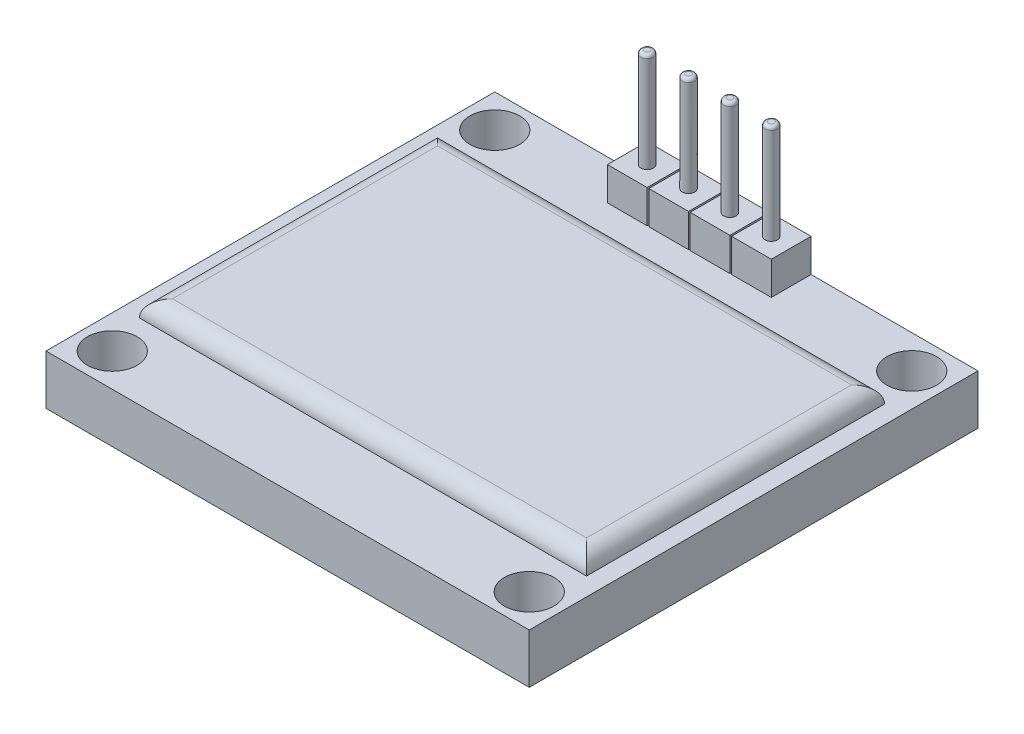
ISO-10303-21;
HEADER;
FILE_DESCRIPTION(('STEP AP214'),'2;1');
FILE_NAME('part.step','',(''),(''),'','','');
FILE_SCHEMA(('AUTOMOTIVE_DESIGN { 1 0 10303 214 1 1 1 1 }'));
ENDSEC;
DATA;
#1=APPLICATION_CONTEXT('core data for automotive mechanical design processes');
#2=APPLICATION_PROTOCOL_DEFINITION('international standard','automotive_design',2000,#1);
#3=PRODUCT_CONTEXT('',#1,'mechanical');
#4=PRODUCT('Part','Part','',(#3));
#5=PRODUCT_RELATED_PRODUCT_CATEGORY('part','',(#4));
#6=PRODUCT_DEFINITION_FORMATION('','',#4);
#7=PRODUCT_DEFINITION_CONTEXT('part definition',#1,'design');
#8=PRODUCT_DEFINITION('design','',#6,#7);
#9=PRODUCT_DEFINITION_SHAPE('','',#8);
#10=(LENGTH_UNIT() NAMED_UNIT(*) SI_UNIT(.MILLI.,.METRE.));
#11=(NAMED_UNIT(*) PLANE_ANGLE_UNIT() SI_UNIT($,.RADIAN.));
#12=(NAMED_UNIT(*) SI_UNIT($,.STERADIAN.) SOLID_ANGLE_UNIT());
#13=UNCERTAINTY_MEASURE_WITH_UNIT(LENGTH_MEASURE(1.E-05),#10,'distance_accuracy_value','');
#14=(GEOMETRIC_REPRESENTATION_CONTEXT(3) GLOBAL_UNCERTAINTY_ASSIGNED_CONTEXT((#13)) GLOBAL_UNIT_ASSIGNED_CONTEXT((#10,
#11,#12)) REPRESENTATION_CONTEXT('',''));
#15=CARTESIAN_POINT('',(0.,0.,0.));
#16=DIRECTION('',(0.,0.,1.));
#17=DIRECTION('',(1.,0.,0.));
#18=AXIS2_PLACEMENT_3D('',#15,#16,#17);
#19=CARTESIAN_POINT('',(0.,5.,0.));
#20=DIRECTION('',(0.,-1.,0.));
#21=DIRECTION('',(0.,0.,-1.));
#22=AXIS2_PLACEMENT_3D('',#19,#20,#21);
#23=PLANE('',#22);
#24=DIRECTION('',(0.,0.,-1.));
#25=VECTOR('',#24,1.);
#26=CARTESIAN_POINT('',(4.50999999999999,5.,-11.15));
#27=LINE('',#26,#25);
#28=CARTESIAN_POINT('',(4.50999999999999,5.,-11.15));
#29=VERTEX_POINT('',#28);
#30=CARTESIAN_POINT('',(4.50999999999999,5.,-13.55));
#31=VERTEX_POINT('',#30);
#32=EDGE_CURVE('E203',#29,#31,#27,.T.);
#33=ORIENTED_EDGE('',*,*,#32,.T.);
#34=DIRECTION('',(-1.,0.,0.));
#35=VECTOR('',#34,1.);
#36=CARTESIAN_POINT('',(2.10999999999999,5.,-13.55));
#37=LINE('',#36,#35);
#38=CARTESIAN_POINT('',(2.10999999999999,5.,-13.55));
#39=VERTEX_POINT('',#38);
#40=EDGE_CURVE('E192',#31,#39,#37,.T.);
#41=ORIENTED_EDGE('',*,*,#40,.T.);
#42=DIRECTION('',(0.,0.,1.));
#43=VECTOR('',#42,1.);
#44=CARTESIAN_POINT('',(2.10999999999999,5.,-11.15));
#45=LINE('',#44,#43);
#46=CARTESIAN_POINT('',(2.10999999999999,5.,-11.15));
#47=VERTEX_POINT('',#46);
#48=EDGE_CURVE('E202',#39,#47,#45,.T.);
#49=ORIENTED_EDGE('',*,*,#48,.T.);
#50=DIRECTION('',(1.,0.,0.));
#51=VECTOR('',#50,1.);
#52=CARTESIAN_POINT('',(2.10999999999999,5.,-11.15));
#53=LINE('',#52,#51);
#54=EDGE_CURVE('E208',#47,#29,#53,.T.);
#55=ORIENTED_EDGE('',*,*,#54,.T.);
#56=EDGE_LOOP('',(#33,#41,#49,#55));
#57=FACE_BOUND('',#56,.T.);
#58=CARTESIAN_POINT('',(3.30999999999999,5.,-12.35));
#59=DIRECTION('',(0.,-1.,0.));
#60=DIRECTION('',(0.,0.,-1.));
#61=AXIS2_PLACEMENT_3D('',#58,#59,#60);
#62=CIRCLE('',#61,0.375);
#63=CARTESIAN_POINT('',(3.30999999999999,5.,-12.725));
#64=VERTEX_POINT('',#63);
#65=EDGE_CURVE('E405',#64,#64,#62,.F.);
#66=ORIENTED_EDGE('',*,*,#65,.F.);
#67=EDGE_LOOP('',(#66));
#68=FACE_BOUND('',#67,.T.);
#69=ADVANCED_FACE('F32',(#57,#68),#23,.F.);
#70=CARTESIAN_POINT('',(0.,5.,0.));
#71=DIRECTION('',(0.,-1.,0.));
#72=DIRECTION('',(0.,0.,-1.));
#73=AXIS2_PLACEMENT_3D('',#70,#71,#72);
#74=PLANE('',#73);
#75=DIRECTION('',(0.,0.,-1.));
#76=VECTOR('',#75,1.);
#77=CARTESIAN_POINT('',(2.00999999999998,5.,-11.15));
#78=LINE('',#77,#76);
#79=CARTESIAN_POINT('',(2.00999999999998,5.,-11.15));
#80=VERTEX_POINT('',#79);
#81=CARTESIAN_POINT('',(2.00999999999998,5.,-13.55));
#82=VERTEX_POINT('',#81);
#83=EDGE_CURVE('E223',#80,#82,#78,.T.);
#84=ORIENTED_EDGE('',*,*,#83,.T.);
#85=DIRECTION('',(-1.,0.,0.));
#86=VECTOR('',#85,1.);
#87=CARTESIAN_POINT('',(-0.390000000000015,5.,-13.55));
#88=LINE('',#87,#86);
#89=CARTESIAN_POINT('',(-0.390000000000015,5.,-13.55));
#90=VERTEX_POINT('',#89);
#91=EDGE_CURVE('E226',#82,#90,#88,.T.);
#92=ORIENTED_EDGE('',*,*,#91,.T.);
#93=DIRECTION('',(0.,0.,1.));
#94=VECTOR('',#93,1.);
#95=CARTESIAN_POINT('',(-0.390000000000015,5.,-11.15));
#96=LINE('',#95,#94);
#97=CARTESIAN_POINT('',(-0.390000000000015,5.,-11.15));
#98=VERTEX_POINT('',#97);
#99=EDGE_CURVE('E229',#90,#98,#96,.T.);
#100=ORIENTED_EDGE('',*,*,#99,.T.);
#101=DIRECTION('',(1.,0.,0.));
#102=VECTOR('',#101,1.);
#103=CARTESIAN_POINT('',(-0.390000000000015,5.,-11.15));
#104=LINE('',#103,#102);
#105=EDGE_CURVE('E231',#98,#80,#104,.T.);
#106=ORIENTED_EDGE('',*,*,#105,.T.);
#107=EDGE_LOOP('',(#84,#92,#100,#106));
#108=FACE_BOUND('',#107,.T.);
#109=CARTESIAN_POINT('',(0.809999999999994,5.,-12.35));
#110=DIRECTION('',(0.,-1.,0.));
#111=DIRECTION('',(0.,0.,-1.));
#112=AXIS2_PLACEMENT_3D('',#109,#110,#111);
#113=CIRCLE('',#112,0.375);
#114=CARTESIAN_POINT('',(0.809999999999994,5.,-12.725));
#115=VERTEX_POINT('',#114);
#116=EDGE_CURVE('E402',#115,#115,#113,.F.);
#117=ORIENTED_EDGE('',*,*,#116,.F.);
#118=EDGE_LOOP('',(#117));
#119=FACE_BOUND('',#118,.T.);
#120=ADVANCED_FACE('F440',(#108,#119),#74,.F.);
#121=CARTESIAN_POINT('',(0.,5.,0.));
#122=DIRECTION('',(0.,-1.,0.));
#123=DIRECTION('',(0.,0.,-1.));
#124=AXIS2_PLACEMENT_3D('',#121,#122,#123);
#125=PLANE('',#124);
#126=DIRECTION('',(0.,0.,-1.));
#127=VECTOR('',#126,1.);
#128=CARTESIAN_POINT('',(-0.490000000000004,5.,-11.15));
#129=LINE('',#128,#127);
#130=CARTESIAN_POINT('',(-0.490000000000004,5.,-11.15));
#131=VERTEX_POINT('',#130);
#132=CARTESIAN_POINT('',(-0.490000000000004,5.,-13.55));
#133=VERTEX_POINT('',#132);
#134=EDGE_CURVE('E250',#131,#133,#129,.T.);
#135=ORIENTED_EDGE('',*,*,#134,.T.);
#136=DIRECTION('',(-1.,0.,0.));
#137=VECTOR('',#136,1.);
#138=CARTESIAN_POINT('',(-2.89,5.,-13.55));
#139=LINE('',#138,#137);
#140=CARTESIAN_POINT('',(-2.89,5.,-13.55));
#141=VERTEX_POINT('',#140);
#142=EDGE_CURVE('E253',#133,#141,#139,.T.);
#143=ORIENTED_EDGE('',*,*,#142,.T.);
#144=DIRECTION('',(0.,0.,1.));
#145=VECTOR('',#144,1.);
#146=CARTESIAN_POINT('',(-2.89,5.,-11.15));
#147=LINE('',#146,#145);
#148=CARTESIAN_POINT('',(-2.89,5.,-11.15));
#149=VERTEX_POINT('',#148);
#150=EDGE_CURVE('E256',#141,#149,#147,.T.);
#151=ORIENTED_EDGE('',*,*,#150,.T.);
#152=DIRECTION('',(1.,0.,0.));
#153=VECTOR('',#152,1.);
#154=CARTESIAN_POINT('',(-2.89,5.,-11.15));
#155=LINE('',#154,#153);
#156=EDGE_CURVE('E258',#149,#131,#155,.T.);
#157=ORIENTED_EDGE('',*,*,#156,.T.);
#158=EDGE_LOOP('',(#135,#143,#151,#157));
#159=FACE_BOUND('',#158,.T.);
#160=CARTESIAN_POINT('',(-1.69000000000001,5.,-12.35));
#161=DIRECTION('',(0.,-1.,0.));
#162=DIRECTION('',(0.,0.,-1.));
#163=AXIS2_PLACEMENT_3D('',#160,#161,#162);
#164=CIRCLE('',#163,0.375);
#165=CARTESIAN_POINT('',(-1.69000000000001,5.,-12.725));
#166=VERTEX_POINT('',#165);
#167=EDGE_CURVE('E399',#166,#166,#164,.F.);
#168=ORIENTED_EDGE('',*,*,#167,.F.);
#169=EDGE_LOOP('',(#168));
#170=FACE_BOUND('',#169,.T.);
#171=ADVANCED_FACE('F445',(#159,#170),#125,.F.);
#172=CARTESIAN_POINT('',(0.,5.,0.));
#173=DIRECTION('',(0.,-1.,0.));
#174=DIRECTION('',(0.,0.,-1.));
#175=AXIS2_PLACEMENT_3D('',#172,#173,#174);
#176=PLANE('',#175);
#177=DIRECTION('',(0.,0.,-1.));
#178=VECTOR('',#177,1.);
#179=CARTESIAN_POINT('',(-2.99000000000001,5.,-11.15));
#180=LINE('',#179,#178);
#181=CARTESIAN_POINT('',(-2.99000000000001,5.,-11.15));
#182=VERTEX_POINT('',#181);
#183=CARTESIAN_POINT('',(-2.99000000000001,5.,-13.55));
#184=VERTEX_POINT('',#183);
#185=EDGE_CURVE('E280',#182,#184,#180,.T.);
#186=ORIENTED_EDGE('',*,*,#185,.T.);
#187=DIRECTION('',(-1.,0.,0.));
#188=VECTOR('',#187,1.);
#189=CARTESIAN_POINT('',(-5.39000000000001,5.,-13.55));
#190=LINE('',#189,#188);
#191=CARTESIAN_POINT('',(-5.39000000000001,5.,-13.55));
#192=VERTEX_POINT('',#191);
#193=EDGE_CURVE('E283',#184,#192,#190,.T.);
#194=ORIENTED_EDGE('',*,*,#193,.T.);
#195=DIRECTION('',(0.,0.,1.));
#196=VECTOR('',#195,1.);
#197=CARTESIAN_POINT('',(-5.39000000000001,5.,-11.15));
#198=LINE('',#197,#196);
#199=CARTESIAN_POINT('',(-5.39000000000001,5.,-11.15));
#200=VERTEX_POINT('',#199);
#201=EDGE_CURVE('E286',#192,#200,#198,.T.);
#202=ORIENTED_EDGE('',*,*,#201,.T.);
#203=DIRECTION('',(1.,0.,0.));
#204=VECTOR('',#203,1.);
#205=CARTESIAN_POINT('',(-5.39000000000001,5.,-11.15));
#206=LINE('',#205,#204);
#207=EDGE_CURVE('E288',#200,#182,#206,.T.);
#208=ORIENTED_EDGE('',*,*,#207,.T.);
#209=EDGE_LOOP('',(#186,#194,#202,#208));
#210=FACE_BOUND('',#209,.T.);
#211=CARTESIAN_POINT('',(-4.19000000000001,5.,-12.35));
#212=DIRECTION('',(0.,-1.,0.));
#213=DIRECTION('',(0.,0.,-1.));
#214=AXIS2_PLACEMENT_3D('',#211,#212,#213);
#215=CIRCLE('',#214,0.375);
#216=CARTESIAN_POINT('',(-4.19000000000001,5.,-12.725));
#217=VERTEX_POINT('',#216);
#218=EDGE_CURVE('E388',#217,#217,#215,.F.);
#219=ORIENTED_EDGE('',*,*,#218,.F.);
#220=EDGE_LOOP('',(#219));
#221=FACE_BOUND('',#220,.T.);
#222=ADVANCED_FACE('F477',(#210,#221),#176,.F.);
#223=CARTESIAN_POINT('',(0.,3.,0.));
#224=DIRECTION('',(0.,1.,0.));
#225=DIRECTION('',(0.,0.,1.));
#226=AXIS2_PLACEMENT_3D('',#223,#224,#225);
#227=PLANE('',#226);
#228=CARTESIAN_POINT('',(-12.59,3.,11.55));
#229=DIRECTION('',(0.,1.,0.));
#230=DIRECTION('',(0.,0.,-1.));
#231=AXIS2_PLACEMENT_3D('',#228,#229,#230);
#232=CIRCLE('',#231,1.5);
#233=CARTESIAN_POINT('',(-12.59,3.,10.05));
#234=VERTEX_POINT('',#233);
#235=EDGE_CURVE('E309',#234,#234,#232,.T.);
#236=ORIENTED_EDGE('',*,*,#235,.F.);
#237=EDGE_LOOP('',(#236));
#238=FACE_BOUND('',#237,.T.);
#239=CARTESIAN_POINT('',(12.59,3.,11.55));
#240=DIRECTION('',(0.,1.,0.));
#241=DIRECTION('',(0.,0.,-1.));
#242=AXIS2_PLACEMENT_3D('',#239,#240,#241);
#243=CIRCLE('',#242,1.5);
#244=CARTESIAN_POINT('',(12.59,3.,10.05));
#245=VERTEX_POINT('',#244);
#246=EDGE_CURVE('E313',#245,#245,#243,.T.);
#247=ORIENTED_EDGE('',*,*,#246,.F.);
#248=EDGE_LOOP('',(#247));
#249=FACE_BOUND('',#248,.T.);
#250=CARTESIAN_POINT('',(12.59,3.,-11.55));
#251=DIRECTION('',(0.,1.,0.));
#252=DIRECTION('',(0.,0.,1.));
#253=AXIS2_PLACEMENT_3D('',#250,#251,#252);
#254=CIRCLE('',#253,1.5);
#255=CARTESIAN_POINT('',(12.59,3.,-10.05));
#256=VERTEX_POINT('',#255);
#257=EDGE_CURVE('E319',#256,#256,#254,.T.);
#258=ORIENTED_EDGE('',*,*,#257,.F.);
#259=EDGE_LOOP('',(#258));
#260=FACE_BOUND('',#259,.T.);
#261=CARTESIAN_POINT('',(-12.59,3.,-11.55));
#262=DIRECTION('',(0.,1.,0.));
#263=DIRECTION('',(0.,0.,1.));
#264=AXIS2_PLACEMENT_3D('',#261,#262,#263);
#265=CIRCLE('',#264,1.5);
#266=CARTESIAN_POINT('',(-12.59,3.,-10.05));
#267=VERTEX_POINT('',#266);
#268=EDGE_CURVE('E325',#267,#267,#265,.T.);
#269=ORIENTED_EDGE('',*,*,#268,.F.);
#270=EDGE_LOOP('',(#269));
#271=FACE_BOUND('',#270,.T.);
#272=DIRECTION('',(1.,0.,0.));
#273=VECTOR('',#272,1.);
#274=CARTESIAN_POINT('',(13.5,3.,9.));
#275=LINE('',#274,#273);
#276=CARTESIAN_POINT('',(-13.5,3.,9.));
#277=VERTEX_POINT('',#276);
#278=CARTESIAN_POINT('',(13.5,3.,9.));
#279=VERTEX_POINT('',#278);
#280=EDGE_CURVE('E337',#277,#279,#275,.T.);
#281=ORIENTED_EDGE('',*,*,#280,.F.);
#282=DIRECTION('',(0.,0.,1.));
#283=VECTOR('',#282,1.);
#284=CARTESIAN_POINT('',(-13.5,3.,9.));
#285=LINE('',#284,#283);
#286=CARTESIAN_POINT('',(-13.5,3.,-9.));
#287=VERTEX_POINT('',#286);
#288=EDGE_CURVE('E334',#287,#277,#285,.T.);
#289=ORIENTED_EDGE('',*,*,#288,.F.);
#290=DIRECTION('',(-1.,0.,0.));
#291=VECTOR('',#290,1.);
#292=CARTESIAN_POINT('',(13.5,3.,-9.));
#293=LINE('',#292,#291);
#294=CARTESIAN_POINT('',(13.5,3.,-9.));
#295=VERTEX_POINT('',#294);
#296=EDGE_CURVE('E344',#295,#287,#293,.T.);
#297=ORIENTED_EDGE('',*,*,#296,.F.);
#298=DIRECTION('',(0.,0.,-1.));
#299=VECTOR('',#298,1.);
#300=CARTESIAN_POINT('',(13.5,3.,9.));
#301=LINE('',#300,#299);
#302=EDGE_CURVE('E341',#279,#295,#301,.T.);
#303=ORIENTED_EDGE('',*,*,#302,.F.);
#304=EDGE_LOOP('',(#281,#289,#297,#303));
#305=FACE_BOUND('',#304,.T.);
#306=DIRECTION('',(-1.,0.,0.));
#307=VECTOR('',#306,1.);
#308=CARTESIAN_POINT('',(14.59,3.,-13.55));
#309=LINE('',#308,#307);
#310=CARTESIAN_POINT('',(14.59,3.,-13.55));
#311=VERTEX_POINT('',#310);
#312=CARTESIAN_POINT('',(4.50999999999999,3.,-13.55));
#313=VERTEX_POINT('',#312);
#314=EDGE_CURVE('E357',#311,#313,#309,.T.);
#315=ORIENTED_EDGE('',*,*,#314,.T.);
#316=DIRECTION('',(0.,0.,-1.));
#317=VECTOR('',#316,1.);
#318=CARTESIAN_POINT('',(4.50999999999999,3.,-11.15));
#319=LINE('',#318,#317);
#320=CARTESIAN_POINT('',(4.50999999999999,3.,-11.15));
#321=VERTEX_POINT('',#320);
#322=EDGE_CURVE('E52',#321,#313,#319,.T.);
#323=ORIENTED_EDGE('',*,*,#322,.F.);
#324=DIRECTION('',(1.,0.,0.));
#325=VECTOR('',#324,1.);
#326=CARTESIAN_POINT('',(2.10999999999999,3.,-11.15));
#327=LINE('',#326,#325);
#328=CARTESIAN_POINT('',(2.10999999999999,3.,-11.15));
#329=VERTEX_POINT('',#328);
#330=EDGE_CURVE('E47',#329,#321,#327,.T.);
#331=ORIENTED_EDGE('',*,*,#330,.F.);
#332=DIRECTION('',(0.,0.,1.));
#333=VECTOR('',#332,1.);
#334=CARTESIAN_POINT('',(2.10999999999999,3.,-11.15));
#335=LINE('',#334,#333);
#336=CARTESIAN_POINT('',(2.10999999999999,3.,-13.55));
#337=VERTEX_POINT('',#336);
#338=EDGE_CURVE('E914',#337,#329,#335,.T.);
#339=ORIENTED_EDGE('',*,*,#338,.F.);
#340=CARTESIAN_POINT('',(2.00999999999998,3.,-13.55));
#341=VERTEX_POINT('',#340);
#342=EDGE_CURVE('E360',#337,#341,#309,.T.);
#343=ORIENTED_EDGE('',*,*,#342,.T.);
#344=DIRECTION('',(0.,0.,-1.));
#345=VECTOR('',#344,1.);
#346=CARTESIAN_POINT('',(2.00999999999998,3.,-11.15));
#347=LINE('',#346,#345);
#348=CARTESIAN_POINT('',(2.00999999999998,3.,-11.15));
#349=VERTEX_POINT('',#348);
#350=EDGE_CURVE('E214',#349,#341,#347,.T.);
#351=ORIENTED_EDGE('',*,*,#350,.F.);
#352=DIRECTION('',(1.,0.,0.));
#353=VECTOR('',#352,1.);
#354=CARTESIAN_POINT('',(-0.390000000000015,3.,-11.15));
#355=LINE('',#354,#353);
#356=CARTESIAN_POINT('',(-0.390000000000015,3.,-11.15));
#357=VERTEX_POINT('',#356);
#358=EDGE_CURVE('E227',#357,#349,#355,.T.);
#359=ORIENTED_EDGE('',*,*,#358,.F.);
#360=DIRECTION('',(0.,0.,1.));
#361=VECTOR('',#360,1.);
#362=CARTESIAN_POINT('',(-0.390000000000015,3.,-11.15));
#363=LINE('',#362,#361);
#364=CARTESIAN_POINT('',(-0.390000000000015,3.,-13.55));
#365=VERTEX_POINT('',#364);
#366=EDGE_CURVE('E217',#365,#357,#363,.T.);
#367=ORIENTED_EDGE('',*,*,#366,.F.);
#368=CARTESIAN_POINT('',(-0.490000000000004,3.,-13.55));
#369=VERTEX_POINT('',#368);
#370=EDGE_CURVE('E912',#365,#369,#309,.T.);
#371=ORIENTED_EDGE('',*,*,#370,.T.);
#372=DIRECTION('',(0.,0.,-1.));
#373=VECTOR('',#372,1.);
#374=CARTESIAN_POINT('',(-0.490000000000004,3.,-11.15));
#375=LINE('',#374,#373);
#376=CARTESIAN_POINT('',(-0.490000000000004,3.,-11.15));
#377=VERTEX_POINT('',#376);
#378=EDGE_CURVE('E249',#377,#369,#375,.T.);
#379=ORIENTED_EDGE('',*,*,#378,.F.);
#380=DIRECTION('',(1.,0.,0.));
#381=VECTOR('',#380,1.);
#382=CARTESIAN_POINT('',(-2.89,3.,-11.15));
#383=LINE('',#382,#381);
#384=CARTESIAN_POINT('',(-2.89,3.,-11.15));
#385=VERTEX_POINT('',#384);
#386=EDGE_CURVE('E254',#385,#377,#383,.T.);
#387=ORIENTED_EDGE('',*,*,#386,.F.);
#388=DIRECTION('',(0.,0.,1.));
#389=VECTOR('',#388,1.);
#390=CARTESIAN_POINT('',(-2.89,3.,-11.15));
#391=LINE('',#390,#389);
#392=CARTESIAN_POINT('',(-2.89,3.,-13.55));
#393=VERTEX_POINT('',#392);
#394=EDGE_CURVE('E263',#393,#385,#391,.T.);
#395=ORIENTED_EDGE('',*,*,#394,.F.);
#396=CARTESIAN_POINT('',(-2.99000000000001,3.,-13.55));
#397=VERTEX_POINT('',#396);
#398=EDGE_CURVE('E904',#393,#397,#309,.T.);
#399=ORIENTED_EDGE('',*,*,#398,.T.);
#400=DIRECTION('',(0.,0.,-1.));
#401=VECTOR('',#400,1.);
#402=CARTESIAN_POINT('',(-2.99000000000001,3.,-11.15));
#403=LINE('',#402,#401);
#404=CARTESIAN_POINT('',(-2.99000000000001,3.,-11.15));
#405=VERTEX_POINT('',#404);
#406=EDGE_CURVE('E279',#405,#397,#403,.T.);
#407=ORIENTED_EDGE('',*,*,#406,.F.);
#408=DIRECTION('',(1.,0.,0.));
#409=VECTOR('',#408,1.);
#410=CARTESIAN_POINT('',(-5.39000000000001,3.,-11.15));
#411=LINE('',#410,#409);
#412=CARTESIAN_POINT('',(-5.39000000000001,3.,-11.15));
#413=VERTEX_POINT('',#412);
#414=EDGE_CURVE('E284',#413,#405,#411,.T.);
#415=ORIENTED_EDGE('',*,*,#414,.F.);
#416=DIRECTION('',(0.,0.,1.));
#417=VECTOR('',#416,1.);
#418=CARTESIAN_POINT('',(-5.39000000000001,3.,-11.15));
#419=LINE('',#418,#417);
#420=CARTESIAN_POINT('',(-5.39000000000001,3.,-13.55));
#421=VERTEX_POINT('',#420);
#422=EDGE_CURVE('E293',#421,#413,#419,.T.);
#423=ORIENTED_EDGE('',*,*,#422,.F.);
#424=CARTESIAN_POINT('',(-14.59,3.,-13.55));
#425=VERTEX_POINT('',#424);
#426=EDGE_CURVE('E356',#421,#425,#309,.T.);
#427=ORIENTED_EDGE('',*,*,#426,.T.);
#428=DIRECTION('',(0.,0.,1.));
#429=VECTOR('',#428,1.);
#430=CARTESIAN_POINT('',(-14.59,3.,13.55));
#431=LINE('',#430,#429);
#432=CARTESIAN_POINT('',(-14.59,3.,13.55));
#433=VERTEX_POINT('',#432);
#434=EDGE_CURVE('E348',#425,#433,#431,.T.);
#435=ORIENTED_EDGE('',*,*,#434,.T.);
#436=DIRECTION('',(1.,0.,0.));
#437=VECTOR('',#436,1.);
#438=CARTESIAN_POINT('',(14.59,3.,13.55));
#439=LINE('',#438,#437);
#440=CARTESIAN_POINT('',(14.59,3.,13.55));
#441=VERTEX_POINT('',#440);
#442=EDGE_CURVE('E351',#433,#441,#439,.T.);
#443=ORIENTED_EDGE('',*,*,#442,.T.);
#444=DIRECTION('',(0.,0.,-1.));
#445=VECTOR('',#444,1.);
#446=CARTESIAN_POINT('',(14.59,3.,13.55));
#447=LINE('',#446,#445);
#448=EDGE_CURVE('E354',#441,#311,#447,.T.);
#449=ORIENTED_EDGE('',*,*,#448,.T.);
#450=EDGE_LOOP('',(#315,#323,#331,#339,#343,#351,#359,#367,#371,#379,#387,#395,#399,#407,#415,
#423,#427,#435,#443,#449));
#451=FACE_BOUND('',#450,.T.);
#452=ADVANCED_FACE('F493',(#238,#249,#260,#271,#305,#451),#227,.T.);
#453=CARTESIAN_POINT('',(-14.59,3.,13.55));
#454=DIRECTION('',(1.,0.,0.));
#455=DIRECTION('',(0.,0.,-1.));
#456=AXIS2_PLACEMENT_3D('',#453,#454,#455);
#457=PLANE('',#456);
#458=DIRECTION('',(0.,0.,1.));
#459=VECTOR('',#458,1.);
#460=CARTESIAN_POINT('',(-14.59,0.,13.55));
#461=LINE('',#460,#459);
#462=CARTESIAN_POINT('',(-14.59,0.,-13.55));
#463=VERTEX_POINT('',#462);
#464=CARTESIAN_POINT('',(-14.59,0.,13.55));
#465=VERTEX_POINT('',#464);
#466=EDGE_CURVE('E347',#463,#465,#461,.T.);
#467=ORIENTED_EDGE('',*,*,#466,.T.);
#468=DIRECTION('',(0.,-1.,0.));
#469=VECTOR('',#468,1.);
#470=CARTESIAN_POINT('',(-14.59,3.,13.55));
#471=LINE('',#470,#469);
#472=EDGE_CURVE('E376',#433,#465,#471,.T.);
#473=ORIENTED_EDGE('',*,*,#472,.F.);
#474=ORIENTED_EDGE('',*,*,#434,.F.);
#475=DIRECTION('',(0.,-1.,0.));
#476=VECTOR('',#475,1.);
#477=CARTESIAN_POINT('',(-14.59,3.,-13.55));
#478=LINE('',#477,#476);
#479=EDGE_CURVE('E359',#425,#463,#478,.T.);
#480=ORIENTED_EDGE('',*,*,#479,.T.);
#481=EDGE_LOOP('',(#467,#473,#474,#480));
#482=FACE_BOUND('',#481,.T.);
#483=ADVANCED_FACE('F531',(#482),#457,.F.);
#484=CARTESIAN_POINT('',(14.59,3.,13.55));
#485=DIRECTION('',(0.,0.,-1.));
#486=DIRECTION('',(-1.,0.,0.));
#487=AXIS2_PLACEMENT_3D('',#484,#485,#486);
#488=PLANE('',#487);
#489=DIRECTION('',(1.,0.,0.));
#490=VECTOR('',#489,1.);
#491=CARTESIAN_POINT('',(14.59,0.,13.55));
#492=LINE('',#491,#490);
#493=CARTESIAN_POINT('',(14.59,0.,13.55));
#494=VERTEX_POINT('',#493);
#495=EDGE_CURVE('E363',#465,#494,#492,.T.);
#496=ORIENTED_EDGE('',*,*,#495,.T.);
#497=DIRECTION('',(0.,-1.,0.));
#498=VECTOR('',#497,1.);
#499=CARTESIAN_POINT('',(14.59,3.,13.55));
#500=LINE('',#499,#498);
#501=EDGE_CURVE('E373',#441,#494,#500,.T.);
#502=ORIENTED_EDGE('',*,*,#501,.F.);
#503=ORIENTED_EDGE('',*,*,#442,.F.);
#504=ORIENTED_EDGE('',*,*,#472,.T.);
#505=EDGE_LOOP('',(#496,#502,#503,#504));
#506=FACE_BOUND('',#505,.T.);
#507=ADVANCED_FACE('F541',(#506),#488,.F.);
#508=CARTESIAN_POINT('',(14.59,3.,13.55));
#509=DIRECTION('',(-1.,0.,0.));
#510=DIRECTION('',(0.,0.,1.));
#511=AXIS2_PLACEMENT_3D('',#508,#509,#510);
#512=PLANE('',#511);
#513=DIRECTION('',(0.,0.,-1.));
#514=VECTOR('',#513,1.);
#515=CARTESIAN_POINT('',(14.59,0.,13.55));
#516=LINE('',#515,#514);
#517=CARTESIAN_POINT('',(14.59,0.,-13.55));
#518=VERTEX_POINT('',#517);
#519=EDGE_CURVE('E365',#494,#518,#516,.T.);
#520=ORIENTED_EDGE('',*,*,#519,.T.);
#521=DIRECTION('',(0.,-1.,0.));
#522=VECTOR('',#521,1.);
#523=CARTESIAN_POINT('',(14.59,3.,-13.55));
#524=LINE('',#523,#522);
#525=EDGE_CURVE('E370',#311,#518,#524,.T.);
#526=ORIENTED_EDGE('',*,*,#525,.F.);
#527=ORIENTED_EDGE('',*,*,#448,.F.);
#528=ORIENTED_EDGE('',*,*,#501,.T.);
#529=EDGE_LOOP('',(#520,#526,#527,#528));
#530=FACE_BOUND('',#529,.T.);
#531=ADVANCED_FACE('F538',(#530),#512,.F.);
#532=CARTESIAN_POINT('',(14.59,3.,-13.55));
#533=DIRECTION('',(0.,0.,1.));
#534=DIRECTION('',(1.,0.,0.));
#535=AXIS2_PLACEMENT_3D('',#532,#533,#534);
#536=PLANE('',#535);
#537=DIRECTION('',(-1.,0.,0.));
#538=VECTOR('',#537,1.);
#539=CARTESIAN_POINT('',(14.59,0.,-13.55));
#540=LINE('',#539,#538);
#541=EDGE_CURVE('E352',#518,#463,#540,.T.);
#542=ORIENTED_EDGE('',*,*,#541,.T.);
#543=ORIENTED_EDGE('',*,*,#479,.F.);
#544=ORIENTED_EDGE('',*,*,#426,.F.);
#545=DIRECTION('',(0.,-1.,0.));
#546=VECTOR('',#545,1.);
#547=CARTESIAN_POINT('',(-5.39000000000001,5.,-13.55));
#548=LINE('',#547,#546);
#549=EDGE_CURVE('E303',#192,#421,#548,.T.);
#550=ORIENTED_EDGE('',*,*,#549,.F.);
#551=ORIENTED_EDGE('',*,*,#193,.F.);
#552=DIRECTION('',(0.,-1.,0.));
#553=VECTOR('',#552,1.);
#554=CARTESIAN_POINT('',(-2.99000000000001,5.,-13.55));
#555=LINE('',#554,#553);
#556=EDGE_CURVE('E306',#184,#397,#555,.T.);
#557=ORIENTED_EDGE('',*,*,#556,.T.);
#558=ORIENTED_EDGE('',*,*,#398,.F.);
#559=DIRECTION('',(0.,-1.,0.));
#560=VECTOR('',#559,1.);
#561=CARTESIAN_POINT('',(-2.89,5.,-13.55));
#562=LINE('',#561,#560);
#563=EDGE_CURVE('E273',#141,#393,#562,.T.);
#564=ORIENTED_EDGE('',*,*,#563,.F.);
#565=ORIENTED_EDGE('',*,*,#142,.F.);
#566=DIRECTION('',(0.,-1.,0.));
#567=VECTOR('',#566,1.);
#568=CARTESIAN_POINT('',(-0.490000000000004,5.,-13.55));
#569=LINE('',#568,#567);
#570=EDGE_CURVE('E276',#133,#369,#569,.T.);
#571=ORIENTED_EDGE('',*,*,#570,.T.);
#572=ORIENTED_EDGE('',*,*,#370,.F.);
#573=DIRECTION('',(0.,-1.,0.));
#574=VECTOR('',#573,1.);
#575=CARTESIAN_POINT('',(-0.390000000000015,5.,-13.55));
#576=LINE('',#575,#574);
#577=EDGE_CURVE('E243',#90,#365,#576,.T.);
#578=ORIENTED_EDGE('',*,*,#577,.F.);
#579=ORIENTED_EDGE('',*,*,#91,.F.);
#580=DIRECTION('',(0.,-1.,0.));
#581=VECTOR('',#580,1.);
#582=CARTESIAN_POINT('',(2.00999999999998,5.,-13.55));
#583=LINE('',#582,#581);
#584=EDGE_CURVE('E246',#82,#341,#583,.T.);
#585=ORIENTED_EDGE('',*,*,#584,.T.);
#586=ORIENTED_EDGE('',*,*,#342,.F.);
#587=DIRECTION('',(0.,-1.,0.));
#588=VECTOR('',#587,1.);
#589=CARTESIAN_POINT('',(2.10999999999999,5.,-13.55));
#590=LINE('',#589,#588);
#591=EDGE_CURVE('E199',#39,#337,#590,.T.);
#592=ORIENTED_EDGE('',*,*,#591,.F.);
#593=ORIENTED_EDGE('',*,*,#40,.F.);
#594=DIRECTION('',(0.,-1.,0.));
#595=VECTOR('',#594,1.);
#596=CARTESIAN_POINT('',(4.50999999999999,5.,-13.55));
#597=LINE('',#596,#595);
#598=EDGE_CURVE('E197',#31,#313,#597,.T.);
#599=ORIENTED_EDGE('',*,*,#598,.T.);
#600=ORIENTED_EDGE('',*,*,#314,.F.);
#601=ORIENTED_EDGE('',*,*,#525,.T.);
#602=EDGE_LOOP('',(#542,#543,#544,#550,#551,#557,#558,#564,#565,#571,#572,#578,#579,#585,#586,
#592,#593,#599,#600,#601));
#603=FACE_BOUND('',#602,.T.);
#604=ADVANCED_FACE('F194',(#603),#536,.F.);
#605=CARTESIAN_POINT('',(0.,0.,0.));
#606=DIRECTION('',(0.,1.,0.));
#607=DIRECTION('',(0.,0.,1.));
#608=AXIS2_PLACEMENT_3D('',#605,#606,#607);
#609=PLANE('',#608);
#610=CARTESIAN_POINT('',(-12.59,0.,11.55));
#611=DIRECTION('',(0.,1.,0.));
#612=DIRECTION('',(0.,0.,-1.));
#613=AXIS2_PLACEMENT_3D('',#610,#611,#612);
#614=CIRCLE('',#613,1.5);
#615=CARTESIAN_POINT('',(-12.59,0.,10.05));
#616=VERTEX_POINT('',#615);
#617=EDGE_CURVE('E310',#616,#616,#614,.T.);
#618=ORIENTED_EDGE('',*,*,#617,.T.);
#619=EDGE_LOOP('',(#618));
#620=FACE_BOUND('',#619,.T.);
#621=CARTESIAN_POINT('',(12.59,0.,11.55));
#622=DIRECTION('',(0.,1.,0.));
#623=DIRECTION('',(0.,0.,-1.));
#624=AXIS2_PLACEMENT_3D('',#621,#622,#623);
#625=CIRCLE('',#624,1.5);
#626=CARTESIAN_POINT('',(12.59,0.,10.05));
#627=VERTEX_POINT('',#626);
#628=EDGE_CURVE('E316',#627,#627,#625,.T.);
#629=ORIENTED_EDGE('',*,*,#628,.T.);
#630=EDGE_LOOP('',(#629));
#631=FACE_BOUND('',#630,.T.);
#632=CARTESIAN_POINT('',(12.59,0.,-11.55));
#633=DIRECTION('',(0.,1.,0.));
#634=DIRECTION('',(0.,0.,1.));
#635=AXIS2_PLACEMENT_3D('',#632,#633,#634);
#636=CIRCLE('',#635,1.5);
#637=CARTESIAN_POINT('',(12.59,0.,-10.05));
#638=VERTEX_POINT('',#637);
#639=EDGE_CURVE('E322',#638,#638,#636,.T.);
#640=ORIENTED_EDGE('',*,*,#639,.T.);
#641=EDGE_LOOP('',(#640));
#642=FACE_BOUND('',#641,.T.);
#643=CARTESIAN_POINT('',(-12.59,0.,-11.55));
#644=DIRECTION('',(0.,1.,0.));
#645=DIRECTION('',(0.,0.,1.));
#646=AXIS2_PLACEMENT_3D('',#643,#644,#645);
#647=CIRCLE('',#646,1.5);
#648=CARTESIAN_POINT('',(-12.59,0.,-10.05));
#649=VERTEX_POINT('',#648);
#650=EDGE_CURVE('E328',#649,#649,#647,.T.);
#651=ORIENTED_EDGE('',*,*,#650,.T.);
#652=EDGE_LOOP('',(#651));
#653=FACE_BOUND('',#652,.T.);
#654=ORIENTED_EDGE('',*,*,#466,.F.);
#655=ORIENTED_EDGE('',*,*,#541,.F.);
#656=ORIENTED_EDGE('',*,*,#519,.F.);
#657=ORIENTED_EDGE('',*,*,#495,.F.);
#658=EDGE_LOOP('',(#654,#655,#656,#657));
#659=FACE_BOUND('',#658,.T.);
#660=ADVANCED_FACE('F527',(#620,#631,#642,#653,#659),#609,.F.);
#661=CARTESIAN_POINT('',(0.,4.,0.));
#662=DIRECTION('',(0.,1.,0.));
#663=DIRECTION('',(0.,0.,1.));
#664=AXIS2_PLACEMENT_3D('',#661,#662,#663);
#665=PLANE('',#664);
#666=DIRECTION('',(0.,0.,-1.));
#667=VECTOR('',#666,1.);
#668=CARTESIAN_POINT('',(12.5,4.,-9.));
#669=LINE('',#668,#667);
#670=CARTESIAN_POINT('',(12.5,4.,8.));
#671=VERTEX_POINT('',#670);
#672=CARTESIAN_POINT('',(12.5,4.,-8.));
#673=VERTEX_POINT('',#672);
#674=EDGE_CURVE('E383',#671,#673,#669,.T.);
#675=ORIENTED_EDGE('',*,*,#674,.T.);
#676=DIRECTION('',(-1.,0.,0.));
#677=VECTOR('',#676,1.);
#678=CARTESIAN_POINT('',(-13.5,4.,-8.));
#679=LINE('',#678,#677);
#680=CARTESIAN_POINT('',(-12.5,4.,-8.));
#681=VERTEX_POINT('',#680);
#682=EDGE_CURVE('E385',#673,#681,#679,.T.);
#683=ORIENTED_EDGE('',*,*,#682,.T.);
#684=DIRECTION('',(0.,0.,1.));
#685=VECTOR('',#684,1.);
#686=CARTESIAN_POINT('',(-12.5,4.,9.));
#687=LINE('',#686,#685);
#688=CARTESIAN_POINT('',(-12.5,4.,8.));
#689=VERTEX_POINT('',#688);
#690=EDGE_CURVE('E379',#681,#689,#687,.T.);
#691=ORIENTED_EDGE('',*,*,#690,.T.);
#692=DIRECTION('',(1.,0.,0.));
#693=VECTOR('',#692,1.);
#694=CARTESIAN_POINT('',(13.5,4.,8.));
#695=LINE('',#694,#693);
#696=EDGE_CURVE('E381',#689,#671,#695,.T.);
#697=ORIENTED_EDGE('',*,*,#696,.T.);
#698=EDGE_LOOP('',(#675,#683,#691,#697));
#699=FACE_BOUND('',#698,.T.);
#700=ADVANCED_FACE('F523',(#699),#665,.T.);
#701=CARTESIAN_POINT('',(0.,3.,8.));
#702=DIRECTION('',(-1.,0.,0.));
#703=DIRECTION('',(0.,0.,1.));
#704=AXIS2_PLACEMENT_3D('',#701,#702,#703);
#705=CYLINDRICAL_SURFACE('',#704,1.);
#706=CARTESIAN_POINT('',(-12.5,3.,8.));
#707=DIRECTION('',(-0.707106781186548,0.,-0.707106781186547));
#708=DIRECTION('',(0.707106781186547,0.,-0.707106781186547));
#709=AXIS2_PLACEMENT_3D('',#706,#707,#708);
#710=ELLIPSE('',#709,1.4142135623731,1.);
#711=EDGE_CURVE('E392',#277,#689,#710,.T.);
#712=ORIENTED_EDGE('',*,*,#711,.F.);
#713=ORIENTED_EDGE('',*,*,#280,.T.);
#714=CARTESIAN_POINT('',(12.5,3.,8.));
#715=DIRECTION('',(-0.707106781186547,0.,0.707106781186547));
#716=DIRECTION('',(-0.707106781186548,0.,-0.707106781186547));
#717=AXIS2_PLACEMENT_3D('',#714,#715,#716);
#718=ELLIPSE('',#717,1.41421356237309,1.);
#719=EDGE_CURVE('E338',#671,#279,#718,.F.);
#720=ORIENTED_EDGE('',*,*,#719,.F.);
#721=ORIENTED_EDGE('',*,*,#696,.F.);
#722=EDGE_LOOP('',(#712,#713,#720,#721));
#723=FACE_BOUND('',#722,.T.);
#724=ADVANCED_FACE('F526',(#723),#705,.T.);
#725=CARTESIAN_POINT('',(12.5,3.,0.));
#726=DIRECTION('',(0.,0.,1.));
#727=DIRECTION('',(1.,0.,0.));
#728=AXIS2_PLACEMENT_3D('',#725,#726,#727);
#729=CYLINDRICAL_SURFACE('',#728,1.);
#730=ORIENTED_EDGE('',*,*,#719,.T.);
#731=ORIENTED_EDGE('',*,*,#302,.T.);
#732=CARTESIAN_POINT('',(12.5,3.,-8.));
#733=DIRECTION('',(0.707106781186548,0.,0.707106781186547));
#734=DIRECTION('',(-0.707106781186547,0.,0.707106781186548));
#735=AXIS2_PLACEMENT_3D('',#732,#733,#734);
#736=ELLIPSE('',#735,1.4142135623731,1.);
#737=EDGE_CURVE('E390',#673,#295,#736,.F.);
#738=ORIENTED_EDGE('',*,*,#737,.F.);
#739=ORIENTED_EDGE('',*,*,#674,.F.);
#740=EDGE_LOOP('',(#730,#731,#738,#739));
#741=FACE_BOUND('',#740,.T.);
#742=ADVANCED_FACE('F555',(#741),#729,.T.);
#743=CARTESIAN_POINT('',(-12.5,3.,0.));
#744=DIRECTION('',(0.,0.,-1.));
#745=DIRECTION('',(-1.,0.,0.));
#746=AXIS2_PLACEMENT_3D('',#743,#744,#745);
#747=CYLINDRICAL_SURFACE('',#746,1.);
#748=ORIENTED_EDGE('',*,*,#711,.T.);
#749=ORIENTED_EDGE('',*,*,#690,.F.);
#750=CARTESIAN_POINT('',(-12.5,3.,-8.));
#751=DIRECTION('',(0.707106781186547,0.,-0.707106781186548));
#752=DIRECTION('',(-0.707106781186548,0.,-0.707106781186547));
#753=AXIS2_PLACEMENT_3D('',#750,#751,#752);
#754=ELLIPSE('',#753,1.41421356237309,1.);
#755=EDGE_CURVE('E331',#287,#681,#754,.T.);
#756=ORIENTED_EDGE('',*,*,#755,.F.);
#757=ORIENTED_EDGE('',*,*,#288,.T.);
#758=EDGE_LOOP('',(#748,#749,#756,#757));
#759=FACE_BOUND('',#758,.T.);
#760=ADVANCED_FACE('F551',(#759),#747,.T.);
#761=CARTESIAN_POINT('',(0.,3.,-8.));
#762=DIRECTION('',(1.,0.,0.));
#763=DIRECTION('',(0.,0.,-1.));
#764=AXIS2_PLACEMENT_3D('',#761,#762,#763);
#765=CYLINDRICAL_SURFACE('',#764,1.);
#766=ORIENTED_EDGE('',*,*,#737,.T.);
#767=ORIENTED_EDGE('',*,*,#296,.T.);
#768=ORIENTED_EDGE('',*,*,#755,.T.);
#769=ORIENTED_EDGE('',*,*,#682,.F.);
#770=EDGE_LOOP('',(#766,#767,#768,#769));
#771=FACE_BOUND('',#770,.T.);
#772=ADVANCED_FACE('F521',(#771),#765,.T.);
#773=CARTESIAN_POINT('',(-12.59,0.,-11.55));
#774=DIRECTION('',(0.,1.,0.));
#775=DIRECTION('',(0.,0.,1.));
#776=AXIS2_PLACEMENT_3D('',#773,#774,#775);
#777=CYLINDRICAL_SURFACE('',#776,1.5);
#778=ORIENTED_EDGE('',*,*,#650,.F.);
#779=EDGE_LOOP('',(#778));
#780=FACE_BOUND('',#779,.T.);
#781=ORIENTED_EDGE('',*,*,#268,.T.);
#782=EDGE_LOOP('',(#781));
#783=FACE_BOUND('',#782,.T.);
#784=ADVANCED_FACE('F517',(#780,#783),#777,.F.);
#785=CARTESIAN_POINT('',(12.59,0.,-11.55));
#786=DIRECTION('',(0.,1.,0.));
#787=DIRECTION('',(0.,0.,1.));
#788=AXIS2_PLACEMENT_3D('',#785,#786,#787);
#789=CYLINDRICAL_SURFACE('',#788,1.5);
#790=ORIENTED_EDGE('',*,*,#639,.F.);
#791=EDGE_LOOP('',(#790));
#792=FACE_BOUND('',#791,.T.);
#793=ORIENTED_EDGE('',*,*,#257,.T.);
#794=EDGE_LOOP('',(#793));
#795=FACE_BOUND('',#794,.T.);
#796=ADVANCED_FACE('F513',(#792,#795),#789,.F.);
#797=CARTESIAN_POINT('',(12.59,0.,11.55));
#798=DIRECTION('',(0.,1.,0.));
#799=DIRECTION('',(0.,0.,1.));
#800=AXIS2_PLACEMENT_3D('',#797,#798,#799);
#801=CYLINDRICAL_SURFACE('',#800,1.5);
#802=ORIENTED_EDGE('',*,*,#628,.F.);
#803=EDGE_LOOP('',(#802));
#804=FACE_BOUND('',#803,.T.);
#805=ORIENTED_EDGE('',*,*,#246,.T.);
#806=EDGE_LOOP('',(#805));
#807=FACE_BOUND('',#806,.T.);
#808=ADVANCED_FACE('F509',(#804,#807),#801,.F.);
#809=CARTESIAN_POINT('',(-12.59,0.,11.55));
#810=DIRECTION('',(0.,1.,0.));
#811=DIRECTION('',(0.,0.,1.));
#812=AXIS2_PLACEMENT_3D('',#809,#810,#811);
#813=CYLINDRICAL_SURFACE('',#812,1.5);
#814=ORIENTED_EDGE('',*,*,#617,.F.);
#815=EDGE_LOOP('',(#814));
#816=FACE_BOUND('',#815,.T.);
#817=ORIENTED_EDGE('',*,*,#235,.T.);
#818=EDGE_LOOP('',(#817));
#819=FACE_BOUND('',#818,.T.);
#820=ADVANCED_FACE('F505',(#816,#819),#813,.F.);
#821=CARTESIAN_POINT('',(-2.99000000000001,5.,-11.15));
#822=DIRECTION('',(-1.,0.,0.));
#823=DIRECTION('',(0.,0.,1.));
#824=AXIS2_PLACEMENT_3D('',#821,#822,#823);
#825=PLANE('',#824);
#826=ORIENTED_EDGE('',*,*,#406,.T.);
#827=ORIENTED_EDGE('',*,*,#556,.F.);
#828=ORIENTED_EDGE('',*,*,#185,.F.);
#829=DIRECTION('',(0.,-1.,0.));
#830=VECTOR('',#829,1.);
#831=CARTESIAN_POINT('',(-2.99000000000001,5.,-11.15));
#832=LINE('',#831,#830);
#833=EDGE_CURVE('E290',#182,#405,#832,.T.);
#834=ORIENTED_EDGE('',*,*,#833,.T.);
#835=EDGE_LOOP('',(#826,#827,#828,#834));
#836=FACE_BOUND('',#835,.T.);
#837=ADVANCED_FACE('F501',(#836),#825,.F.);
#838=CARTESIAN_POINT('',(-5.39000000000001,5.,-11.15));
#839=DIRECTION('',(1.,0.,0.));
#840=DIRECTION('',(0.,0.,-1.));
#841=AXIS2_PLACEMENT_3D('',#838,#839,#840);
#842=PLANE('',#841);
#843=ORIENTED_EDGE('',*,*,#422,.T.);
#844=DIRECTION('',(0.,-1.,0.));
#845=VECTOR('',#844,1.);
#846=CARTESIAN_POINT('',(-5.39000000000001,5.,-11.15));
#847=LINE('',#846,#845);
#848=EDGE_CURVE('E300',#200,#413,#847,.T.);
#849=ORIENTED_EDGE('',*,*,#848,.F.);
#850=ORIENTED_EDGE('',*,*,#201,.F.);
#851=ORIENTED_EDGE('',*,*,#549,.T.);
#852=EDGE_LOOP('',(#843,#849,#850,#851));
#853=FACE_BOUND('',#852,.T.);
#854=ADVANCED_FACE('F497',(#853),#842,.F.);
#855=CARTESIAN_POINT('',(-5.39000000000001,5.,-11.15));
#856=DIRECTION('',(0.,0.,-1.));
#857=DIRECTION('',(-1.,0.,0.));
#858=AXIS2_PLACEMENT_3D('',#855,#856,#857);
#859=PLANE('',#858);
#860=ORIENTED_EDGE('',*,*,#414,.T.);
#861=ORIENTED_EDGE('',*,*,#833,.F.);
#862=ORIENTED_EDGE('',*,*,#207,.F.);
#863=ORIENTED_EDGE('',*,*,#848,.T.);
#864=EDGE_LOOP('',(#860,#861,#862,#863));
#865=FACE_BOUND('',#864,.T.);
#866=ADVANCED_FACE('F489',(#865),#859,.F.);
#867=CARTESIAN_POINT('',(-0.490000000000004,5.,-11.15));
#868=DIRECTION('',(-1.,0.,0.));
#869=DIRECTION('',(0.,0.,1.));
#870=AXIS2_PLACEMENT_3D('',#867,#868,#869);
#871=PLANE('',#870);
#872=ORIENTED_EDGE('',*,*,#378,.T.);
#873=ORIENTED_EDGE('',*,*,#570,.F.);
#874=ORIENTED_EDGE('',*,*,#134,.F.);
#875=DIRECTION('',(0.,-1.,0.));
#876=VECTOR('',#875,1.);
#877=CARTESIAN_POINT('',(-0.490000000000004,5.,-11.15));
#878=LINE('',#877,#876);
#879=EDGE_CURVE('E260',#131,#377,#878,.T.);
#880=ORIENTED_EDGE('',*,*,#879,.T.);
#881=EDGE_LOOP('',(#872,#873,#874,#880));
#882=FACE_BOUND('',#881,.T.);
#883=ADVANCED_FACE('F485',(#882),#871,.F.);
#884=CARTESIAN_POINT('',(-2.89,5.,-11.15));
#885=DIRECTION('',(1.,0.,0.));
#886=DIRECTION('',(0.,0.,-1.));
#887=AXIS2_PLACEMENT_3D('',#884,#885,#886);
#888=PLANE('',#887);
#889=ORIENTED_EDGE('',*,*,#394,.T.);
#890=DIRECTION('',(0.,-1.,0.));
#891=VECTOR('',#890,1.);
#892=CARTESIAN_POINT('',(-2.89,5.,-11.15));
#893=LINE('',#892,#891);
#894=EDGE_CURVE('E270',#149,#385,#893,.T.);
#895=ORIENTED_EDGE('',*,*,#894,.F.);
#896=ORIENTED_EDGE('',*,*,#150,.F.);
#897=ORIENTED_EDGE('',*,*,#563,.T.);
#898=EDGE_LOOP('',(#889,#895,#896,#897));
#899=FACE_BOUND('',#898,.T.);
#900=ADVANCED_FACE('F481',(#899),#888,.F.);
#901=CARTESIAN_POINT('',(-2.89,5.,-11.15));
#902=DIRECTION('',(0.,0.,-1.));
#903=DIRECTION('',(-1.,0.,0.));
#904=AXIS2_PLACEMENT_3D('',#901,#902,#903);
#905=PLANE('',#904);
#906=ORIENTED_EDGE('',*,*,#386,.T.);
#907=ORIENTED_EDGE('',*,*,#879,.F.);
#908=ORIENTED_EDGE('',*,*,#156,.F.);
#909=ORIENTED_EDGE('',*,*,#894,.T.);
#910=EDGE_LOOP('',(#906,#907,#908,#909));
#911=FACE_BOUND('',#910,.T.);
#912=ADVANCED_FACE('F473',(#911),#905,.F.);
#913=CARTESIAN_POINT('',(2.00999999999998,5.,-11.15));
#914=DIRECTION('',(-1.,0.,0.));
#915=DIRECTION('',(0.,0.,1.));
#916=AXIS2_PLACEMENT_3D('',#913,#914,#915);
#917=PLANE('',#916);
#918=ORIENTED_EDGE('',*,*,#350,.T.);
#919=ORIENTED_EDGE('',*,*,#584,.F.);
#920=ORIENTED_EDGE('',*,*,#83,.F.);
#921=DIRECTION('',(0.,-1.,0.));
#922=VECTOR('',#921,1.);
#923=CARTESIAN_POINT('',(2.00999999999998,5.,-11.15));
#924=LINE('',#923,#922);
#925=EDGE_CURVE('E232',#80,#349,#924,.T.);
#926=ORIENTED_EDGE('',*,*,#925,.T.);
#927=EDGE_LOOP('',(#918,#919,#920,#926));
#928=FACE_BOUND('',#927,.T.);
#929=ADVANCED_FACE('F469',(#928),#917,.F.);
#930=CARTESIAN_POINT('',(-0.390000000000015,5.,-11.15));
#931=DIRECTION('',(1.,0.,0.));
#932=DIRECTION('',(0.,0.,-1.));
#933=AXIS2_PLACEMENT_3D('',#930,#931,#932);
#934=PLANE('',#933);
#935=ORIENTED_EDGE('',*,*,#366,.T.);
#936=DIRECTION('',(0.,-1.,0.));
#937=VECTOR('',#936,1.);
#938=CARTESIAN_POINT('',(-0.390000000000015,5.,-11.15));
#939=LINE('',#938,#937);
#940=EDGE_CURVE('E240',#98,#357,#939,.T.);
#941=ORIENTED_EDGE('',*,*,#940,.F.);
#942=ORIENTED_EDGE('',*,*,#99,.F.);
#943=ORIENTED_EDGE('',*,*,#577,.T.);
#944=EDGE_LOOP('',(#935,#941,#942,#943));
#945=FACE_BOUND('',#944,.T.);
#946=ADVANCED_FACE('F465',(#945),#934,.F.);
#947=CARTESIAN_POINT('',(-0.390000000000015,5.,-11.15));
#948=DIRECTION('',(0.,0.,-1.));
#949=DIRECTION('',(-1.,0.,0.));
#950=AXIS2_PLACEMENT_3D('',#947,#948,#949);
#951=PLANE('',#950);
#952=ORIENTED_EDGE('',*,*,#358,.T.);
#953=ORIENTED_EDGE('',*,*,#925,.F.);
#954=ORIENTED_EDGE('',*,*,#105,.F.);
#955=ORIENTED_EDGE('',*,*,#940,.T.);
#956=EDGE_LOOP('',(#952,#953,#954,#955));
#957=FACE_BOUND('',#956,.T.);
#958=ADVANCED_FACE('F461',(#957),#951,.F.);
#959=CARTESIAN_POINT('',(4.50999999999999,5.,-11.15));
#960=DIRECTION('',(-1.,0.,0.));
#961=DIRECTION('',(0.,0.,1.));
#962=AXIS2_PLACEMENT_3D('',#959,#960,#961);
#963=PLANE('',#962);
#964=ORIENTED_EDGE('',*,*,#322,.T.);
#965=ORIENTED_EDGE('',*,*,#598,.F.);
#966=ORIENTED_EDGE('',*,*,#32,.F.);
#967=DIRECTION('',(0.,-1.,0.));
#968=VECTOR('',#967,1.);
#969=CARTESIAN_POINT('',(4.50999999999999,5.,-11.15));
#970=LINE('',#969,#968);
#971=EDGE_CURVE('E932',#29,#321,#970,.T.);
#972=ORIENTED_EDGE('',*,*,#971,.T.);
#973=EDGE_LOOP('',(#964,#965,#966,#972));
#974=FACE_BOUND('',#973,.T.);
#975=ADVANCED_FACE('F213',(#974),#963,.F.);
#976=CARTESIAN_POINT('',(2.10999999999999,5.,-11.15));
#977=DIRECTION('',(1.,0.,0.));
#978=DIRECTION('',(0.,0.,-1.));
#979=AXIS2_PLACEMENT_3D('',#976,#977,#978);
#980=PLANE('',#979);
#981=ORIENTED_EDGE('',*,*,#338,.T.);
#982=DIRECTION('',(0.,-1.,0.));
#983=VECTOR('',#982,1.);
#984=CARTESIAN_POINT('',(2.10999999999999,5.,-11.15));
#985=LINE('',#984,#983);
#986=EDGE_CURVE('E219',#47,#329,#985,.T.);
#987=ORIENTED_EDGE('',*,*,#986,.F.);
#988=ORIENTED_EDGE('',*,*,#48,.F.);
#989=ORIENTED_EDGE('',*,*,#591,.T.);
#990=EDGE_LOOP('',(#981,#987,#988,#989));
#991=FACE_BOUND('',#990,.T.);
#992=ADVANCED_FACE('F455',(#991),#980,.F.);
#993=CARTESIAN_POINT('',(2.10999999999999,5.,-11.15));
#994=DIRECTION('',(0.,0.,-1.));
#995=DIRECTION('',(-1.,0.,0.));
#996=AXIS2_PLACEMENT_3D('',#993,#994,#995);
#997=PLANE('',#996);
#998=ORIENTED_EDGE('',*,*,#330,.T.);
#999=ORIENTED_EDGE('',*,*,#971,.F.);
#1000=ORIENTED_EDGE('',*,*,#54,.F.);
#1001=ORIENTED_EDGE('',*,*,#986,.T.);
#1002=EDGE_LOOP('',(#998,#999,#1000,#1001));
#1003=FACE_BOUND('',#1002,.T.);
#1004=ADVANCED_FACE('F452',(#1003),#997,.F.);
#1005=CARTESIAN_POINT('',(-4.19000000000001,11.,-12.35));
#1006=DIRECTION('',(0.,-1.,0.));
#1007=DIRECTION('',(0.,0.,-1.));
#1008=AXIS2_PLACEMENT_3D('',#1005,#1006,#1007);
#1009=CYLINDRICAL_SURFACE('',#1008,0.375);
#1010=CARTESIAN_POINT('',(-4.19000000000001,10.8,-12.35));
#1011=DIRECTION('',(0.,1.,0.));
#1012=DIRECTION('',(0.,0.,1.));
#1013=AXIS2_PLACEMENT_3D('',#1010,#1011,#1012);
#1014=CIRCLE('',#1013,0.375);
#1015=CARTESIAN_POINT('',(-4.19000000000001,10.8,-11.975));
#1016=VERTEX_POINT('',#1015);
#1017=EDGE_CURVE('E11',#1016,#1016,#1014,.F.);
#1018=ORIENTED_EDGE('',*,*,#1017,.T.);
#1019=EDGE_LOOP('',(#1018));
#1020=FACE_BOUND('',#1019,.T.);
#1021=ORIENTED_EDGE('',*,*,#218,.T.);
#1022=EDGE_LOOP('',(#1021));
#1023=FACE_BOUND('',#1022,.T.);
#1024=ADVANCED_FACE('F450',(#1020,#1023),#1009,.T.);
#1025=CARTESIAN_POINT('',(-4.19000000000001,11.,-12.35));
#1026=DIRECTION('',(0.,1.,0.));
#1027=DIRECTION('',(0.,0.,1.));
#1028=AXIS2_PLACEMENT_3D('',#1025,#1026,#1027);
#1029=PLANE('',#1028);
#1030=CARTESIAN_POINT('',(-4.19000000000001,11.,-12.35));
#1031=DIRECTION('',(0.,1.,0.));
#1032=DIRECTION('',(0.,0.,1.));
#1033=AXIS2_PLACEMENT_3D('',#1030,#1031,#1032);
#1034=CIRCLE('',#1033,0.175);
#1035=CARTESIAN_POINT('',(-4.19000000000001,11.,-12.175));
#1036=VERTEX_POINT('',#1035);
#1037=EDGE_CURVE('E40',#1036,#1036,#1034,.T.);
#1038=ORIENTED_EDGE('',*,*,#1037,.T.);
#1039=EDGE_LOOP('',(#1038));
#1040=FACE_BOUND('',#1039,.T.);
#1041=ADVANCED_FACE('F428',(#1040),#1029,.T.);
#1042=CARTESIAN_POINT('',(-1.69000000000001,11.,-12.35));
#1043=DIRECTION('',(0.,-1.,0.));
#1044=DIRECTION('',(0.,0.,-1.));
#1045=AXIS2_PLACEMENT_3D('',#1042,#1043,#1044);
#1046=CYLINDRICAL_SURFACE('',#1045,0.375);
#1047=CARTESIAN_POINT('',(-1.69000000000001,10.8,-12.35));
#1048=DIRECTION('',(0.,1.,0.));
#1049=DIRECTION('',(0.,0.,1.));
#1050=AXIS2_PLACEMENT_3D('',#1047,#1048,#1049);
#1051=CIRCLE('',#1050,0.375);
#1052=CARTESIAN_POINT('',(-1.69000000000001,10.8,-11.975));
#1053=VERTEX_POINT('',#1052);
#1054=EDGE_CURVE('E423',#1053,#1053,#1051,.F.);
#1055=ORIENTED_EDGE('',*,*,#1054,.T.);
#1056=EDGE_LOOP('',(#1055));
#1057=FACE_BOUND('',#1056,.T.);
#1058=ORIENTED_EDGE('',*,*,#167,.T.);
#1059=EDGE_LOOP('',(#1058));
#1060=FACE_BOUND('',#1059,.T.);
#1061=ADVANCED_FACE('F594',(#1057,#1060),#1046,.T.);
#1062=CARTESIAN_POINT('',(-1.69000000000001,11.,-12.35));
#1063=DIRECTION('',(0.,1.,0.));
#1064=DIRECTION('',(0.,0.,1.));
#1065=AXIS2_PLACEMENT_3D('',#1062,#1063,#1064);
#1066=PLANE('',#1065);
#1067=CARTESIAN_POINT('',(-1.69000000000001,11.,-12.35));
#1068=DIRECTION('',(0.,1.,0.));
#1069=DIRECTION('',(0.,0.,1.));
#1070=AXIS2_PLACEMENT_3D('',#1067,#1068,#1069);
#1071=CIRCLE('',#1070,0.175);
#1072=CARTESIAN_POINT('',(-1.69000000000001,11.,-12.175));
#1073=VERTEX_POINT('',#1072);
#1074=EDGE_CURVE('E420',#1073,#1073,#1071,.T.);
#1075=ORIENTED_EDGE('',*,*,#1074,.T.);
#1076=EDGE_LOOP('',(#1075));
#1077=FACE_BOUND('',#1076,.T.);
#1078=ADVANCED_FACE('F587',(#1077),#1066,.T.);
#1079=CARTESIAN_POINT('',(0.809999999999994,11.,-12.35));
#1080=DIRECTION('',(0.,-1.,0.));
#1081=DIRECTION('',(0.,0.,-1.));
#1082=AXIS2_PLACEMENT_3D('',#1079,#1080,#1081);
#1083=CYLINDRICAL_SURFACE('',#1082,0.375);
#1084=CARTESIAN_POINT('',(0.809999999999994,10.8,-12.35));
#1085=DIRECTION('',(0.,1.,0.));
#1086=DIRECTION('',(0.,0.,1.));
#1087=AXIS2_PLACEMENT_3D('',#1084,#1085,#1086);
#1088=CIRCLE('',#1087,0.375);
#1089=CARTESIAN_POINT('',(0.809999999999994,10.8,-11.975));
#1090=VERTEX_POINT('',#1089);
#1091=EDGE_CURVE('E417',#1090,#1090,#1088,.F.);
#1092=ORIENTED_EDGE('',*,*,#1091,.T.);
#1093=EDGE_LOOP('',(#1092));
#1094=FACE_BOUND('',#1093,.T.);
#1095=ORIENTED_EDGE('',*,*,#116,.T.);
#1096=EDGE_LOOP('',(#1095));
#1097=FACE_BOUND('',#1096,.T.);
#1098=ADVANCED_FACE('F579',(#1094,#1097),#1083,.T.);
#1099=CARTESIAN_POINT('',(0.809999999999994,11.,-12.35));
#1100=DIRECTION('',(0.,1.,0.));
#1101=DIRECTION('',(0.,0.,1.));
#1102=AXIS2_PLACEMENT_3D('',#1099,#1100,#1101);
#1103=PLANE('',#1102);
#1104=CARTESIAN_POINT('',(0.809999999999994,11.,-12.35));
#1105=DIRECTION('',(0.,1.,0.));
#1106=DIRECTION('',(0.,0.,1.));
#1107=AXIS2_PLACEMENT_3D('',#1104,#1105,#1106);
#1108=CIRCLE('',#1107,0.175);
#1109=CARTESIAN_POINT('',(0.809999999999994,11.,-12.175));
#1110=VERTEX_POINT('',#1109);
#1111=EDGE_CURVE('E414',#1110,#1110,#1108,.T.);
#1112=ORIENTED_EDGE('',*,*,#1111,.T.);
#1113=EDGE_LOOP('',(#1112));
#1114=FACE_BOUND('',#1113,.T.);
#1115=ADVANCED_FACE('F576',(#1114),#1103,.T.);
#1116=CARTESIAN_POINT('',(3.30999999999999,11.,-12.35));
#1117=DIRECTION('',(0.,-1.,0.));
#1118=DIRECTION('',(0.,0.,-1.));
#1119=AXIS2_PLACEMENT_3D('',#1116,#1117,#1118);
#1120=CYLINDRICAL_SURFACE('',#1119,0.375);
#1121=CARTESIAN_POINT('',(3.30999999999999,10.8,-12.35));
#1122=DIRECTION('',(0.,1.,0.));
#1123=DIRECTION('',(0.,0.,1.));
#1124=AXIS2_PLACEMENT_3D('',#1121,#1122,#1123);
#1125=CIRCLE('',#1124,0.375);
#1126=CARTESIAN_POINT('',(3.30999999999999,10.8,-11.975));
#1127=VERTEX_POINT('',#1126);
#1128=EDGE_CURVE('E411',#1127,#1127,#1125,.F.);
#1129=ORIENTED_EDGE('',*,*,#1128,.T.);
#1130=EDGE_LOOP('',(#1129));
#1131=FACE_BOUND('',#1130,.T.);
#1132=ORIENTED_EDGE('',*,*,#65,.T.);
#1133=EDGE_LOOP('',(#1132));
#1134=FACE_BOUND('',#1133,.T.);
#1135=ADVANCED_FACE('F578',(#1131,#1134),#1120,.T.);
#1136=CARTESIAN_POINT('',(3.30999999999999,11.,-12.35));
#1137=DIRECTION('',(0.,1.,0.));
#1138=DIRECTION('',(0.,0.,1.));
#1139=AXIS2_PLACEMENT_3D('',#1136,#1137,#1138);
#1140=PLANE('',#1139);
#1141=CARTESIAN_POINT('',(3.30999999999999,11.,-12.35));
#1142=DIRECTION('',(0.,1.,0.));
#1143=DIRECTION('',(0.,0.,1.));
#1144=AXIS2_PLACEMENT_3D('',#1141,#1142,#1143);
#1145=CIRCLE('',#1144,0.175);
#1146=CARTESIAN_POINT('',(3.30999999999999,11.,-12.175));
#1147=VERTEX_POINT('',#1146);
#1148=EDGE_CURVE('E408',#1147,#1147,#1145,.T.);
#1149=ORIENTED_EDGE('',*,*,#1148,.T.);
#1150=EDGE_LOOP('',(#1149));
#1151=FACE_BOUND('',#1150,.T.);
#1152=ADVANCED_FACE('F566',(#1151),#1140,.T.);
#1153=CARTESIAN_POINT('',(3.30999999999999,10.8,-12.35));
#1154=DIRECTION('',(0.,1.,0.));
#1155=DIRECTION('',(0.,0.,1.));
#1156=AXIS2_PLACEMENT_3D('',#1153,#1154,#1155);
#1157=DEGENERATE_TOROIDAL_SURFACE('',#1156,0.175,0.2,.T.);
#1158=ORIENTED_EDGE('',*,*,#1128,.F.);
#1159=EDGE_LOOP('',(#1158));
#1160=FACE_BOUND('',#1159,.T.);
#1161=ORIENTED_EDGE('',*,*,#1148,.F.);
#1162=EDGE_LOOP('',(#1161));
#1163=FACE_BOUND('',#1162,.T.);
#1164=ADVANCED_FACE('F563',(#1160,#1163),#1157,.T.);
#1165=CARTESIAN_POINT('',(0.809999999999994,10.8,-12.35));
#1166=DIRECTION('',(0.,1.,0.));
#1167=DIRECTION('',(0.,0.,1.));
#1168=AXIS2_PLACEMENT_3D('',#1165,#1166,#1167);
#1169=DEGENERATE_TOROIDAL_SURFACE('',#1168,0.175,0.2,.T.);
#1170=ORIENTED_EDGE('',*,*,#1091,.F.);
#1171=EDGE_LOOP('',(#1170));
#1172=FACE_BOUND('',#1171,.T.);
#1173=ORIENTED_EDGE('',*,*,#1111,.F.);
#1174=EDGE_LOOP('',(#1173));
#1175=FACE_BOUND('',#1174,.T.);
#1176=ADVANCED_FACE('F436',(#1172,#1175),#1169,.T.);
#1177=CARTESIAN_POINT('',(-1.69000000000001,10.8,-12.35));
#1178=DIRECTION('',(0.,1.,0.));
#1179=DIRECTION('',(0.,0.,1.));
#1180=AXIS2_PLACEMENT_3D('',#1177,#1178,#1179);
#1181=DEGENERATE_TOROIDAL_SURFACE('',#1180,0.175,0.2,.T.);
#1182=ORIENTED_EDGE('',*,*,#1054,.F.);
#1183=EDGE_LOOP('',(#1182));
#1184=FACE_BOUND('',#1183,.T.);
#1185=ORIENTED_EDGE('',*,*,#1074,.F.);
#1186=EDGE_LOOP('',(#1185));
#1187=FACE_BOUND('',#1186,.T.);
#1188=ADVANCED_FACE('F431',(#1184,#1187),#1181,.T.);
#1189=CARTESIAN_POINT('',(-4.19000000000001,10.8,-12.35));
#1190=DIRECTION('',(0.,1.,0.));
#1191=DIRECTION('',(0.,0.,1.));
#1192=AXIS2_PLACEMENT_3D('',#1189,#1190,#1191);
#1193=DEGENERATE_TOROIDAL_SURFACE('',#1192,0.175,0.2,.T.);
#1194=ORIENTED_EDGE('',*,*,#1017,.F.);
#1195=EDGE_LOOP('',(#1194));
#1196=FACE_BOUND('',#1195,.T.);
#1197=ORIENTED_EDGE('',*,*,#1037,.F.);
#1198=EDGE_LOOP('',(#1197));
#1199=FACE_BOUND('',#1198,.T.);
#1200=ADVANCED_FACE('F34',(#1196,#1199),#1193,.T.);
#1201=CLOSED_SHELL('',(#69,#120,#171,#222,#452,#483,#507,#531,#604,#660,#700,#724,#742,#760,
#772,#784,#796,#808,#820,#837,#854,#866,#883,#900,#912,#929,#946,#958,#975,#992,#1004,#1024,
#1041,#1061,#1078,#1098,#1115,#1135,#1152,#1164,#1176,#1188,#1200));
#1202=MANIFOLD_SOLID_BREP('B2',#1201);
#1203=ADVANCED_BREP_SHAPE_REPRESENTATION('',(#18,#1202),#14);
#1204=SHAPE_DEFINITION_REPRESENTATION(#9,#1203);
ENDSEC;
END-ISO-10303-21;
